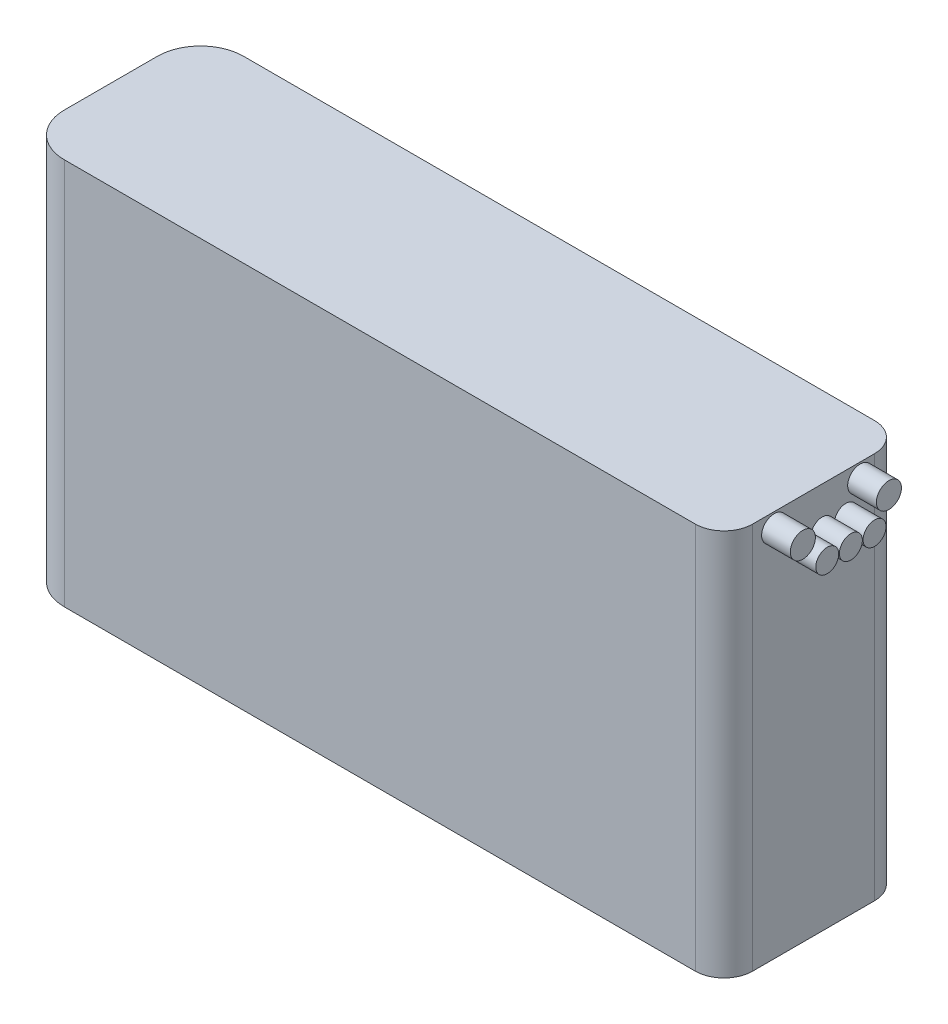
ISO-10303-21;
HEADER;
FILE_DESCRIPTION(('STEP AP214'),'2;1');
FILE_NAME('part.step','',(''),(''),'','','');
FILE_SCHEMA(('AUTOMOTIVE_DESIGN { 1 0 10303 214 1 1 1 1 }'));
ENDSEC;
DATA;
#1=APPLICATION_CONTEXT('core data for automotive mechanical design processes');
#2=APPLICATION_PROTOCOL_DEFINITION('international standard','automotive_design',2000,#1);
#3=PRODUCT_CONTEXT('',#1,'mechanical');
#4=PRODUCT('Part','Part','',(#3));
#5=PRODUCT_RELATED_PRODUCT_CATEGORY('part','',(#4));
#6=PRODUCT_DEFINITION_FORMATION('','',#4);
#7=PRODUCT_DEFINITION_CONTEXT('part definition',#1,'design');
#8=PRODUCT_DEFINITION('design','',#6,#7);
#9=PRODUCT_DEFINITION_SHAPE('','',#8);
#10=(LENGTH_UNIT() NAMED_UNIT(*) SI_UNIT(.MILLI.,.METRE.));
#11=(NAMED_UNIT(*) PLANE_ANGLE_UNIT() SI_UNIT($,.RADIAN.));
#12=(NAMED_UNIT(*) SI_UNIT($,.STERADIAN.) SOLID_ANGLE_UNIT());
#13=UNCERTAINTY_MEASURE_WITH_UNIT(LENGTH_MEASURE(1.E-05),#10,'distance_accuracy_value','');
#14=(GEOMETRIC_REPRESENTATION_CONTEXT(3) GLOBAL_UNCERTAINTY_ASSIGNED_CONTEXT((#13)) GLOBAL_UNIT_ASSIGNED_CONTEXT((#10,
#11,#12)) REPRESENTATION_CONTEXT('',''));
#15=CARTESIAN_POINT('',(0.,0.,0.));
#16=DIRECTION('',(0.,0.,1.));
#17=DIRECTION('',(1.,0.,0.));
#18=AXIS2_PLACEMENT_3D('',#15,#16,#17);
#19=CARTESIAN_POINT('',(0.,0.,12.5));
#20=DIRECTION('',(1.,0.,0.));
#21=DIRECTION('',(0.,0.,-1.));
#22=AXIS2_PLACEMENT_3D('',#19,#20,#21);
#23=PLANE('',#22);
#24=DIRECTION('',(0.,0.,-1.));
#25=VECTOR('',#24,1.);
#26=CARTESIAN_POINT('',(0.,0.,12.5));
#27=LINE('',#26,#25);
#28=CARTESIAN_POINT('',(0.,0.,9.5));
#29=VERTEX_POINT('',#28);
#30=CARTESIAN_POINT('',(0.,0.,3.));
#31=VERTEX_POINT('',#30);
#32=EDGE_CURVE('E136',#29,#31,#27,.T.);
#33=ORIENTED_EDGE('',*,*,#32,.F.);
#34=DIRECTION('',(0.,-1.,0.));
#35=VECTOR('',#34,1.);
#36=CARTESIAN_POINT('',(0.,0.,9.5));
#37=LINE('',#36,#35);
#38=CARTESIAN_POINT('',(0.,27.,9.5));
#39=VERTEX_POINT('',#38);
#40=EDGE_CURVE('E167',#29,#39,#37,.F.);
#41=ORIENTED_EDGE('',*,*,#40,.T.);
#42=DIRECTION('',(0.,0.,-1.));
#43=VECTOR('',#42,1.);
#44=CARTESIAN_POINT('',(0.,27.,12.5));
#45=LINE('',#44,#43);
#46=CARTESIAN_POINT('',(0.,27.,3.));
#47=VERTEX_POINT('',#46);
#48=EDGE_CURVE('E130',#39,#47,#45,.T.);
#49=ORIENTED_EDGE('',*,*,#48,.T.);
#50=DIRECTION('',(0.,-1.,0.));
#51=VECTOR('',#50,1.);
#52=CARTESIAN_POINT('',(0.,0.,3.));
#53=LINE('',#52,#51);
#54=EDGE_CURVE('E163',#47,#31,#53,.T.);
#55=ORIENTED_EDGE('',*,*,#54,.T.);
#56=EDGE_LOOP('',(#33,#41,#49,#55));
#57=FACE_BOUND('',#56,.T.);
#58=ADVANCED_FACE('F39',(#57),#23,.F.);
#59=CARTESIAN_POINT('',(0.,0.,12.5));
#60=DIRECTION('',(0.,1.,0.));
#61=DIRECTION('',(0.,0.,1.));
#62=AXIS2_PLACEMENT_3D('',#59,#60,#61);
#63=PLANE('',#62);
#64=DIRECTION('',(1.,0.,0.));
#65=VECTOR('',#64,1.);
#66=CARTESIAN_POINT('',(0.,0.,12.5));
#67=LINE('',#66,#65);
#68=CARTESIAN_POINT('',(3.,0.,12.5));
#69=VERTEX_POINT('',#68);
#70=CARTESIAN_POINT('',(47.,0.,12.5));
#71=VERTEX_POINT('',#70);
#72=EDGE_CURVE('E240',#69,#71,#67,.T.);
#73=ORIENTED_EDGE('',*,*,#72,.F.);
#74=CARTESIAN_POINT('',(3.,0.,9.5));
#75=DIRECTION('',(0.,1.,0.));
#76=DIRECTION('',(0.,0.,1.));
#77=AXIS2_PLACEMENT_3D('',#74,#75,#76);
#78=CIRCLE('',#77,3.);
#79=EDGE_CURVE('E161',#69,#29,#78,.F.);
#80=ORIENTED_EDGE('',*,*,#79,.T.);
#81=ORIENTED_EDGE('',*,*,#32,.T.);
#82=CARTESIAN_POINT('',(3.,0.,3.));
#83=DIRECTION('',(0.,1.,0.));
#84=DIRECTION('',(0.,0.,1.));
#85=AXIS2_PLACEMENT_3D('',#82,#83,#84);
#86=CIRCLE('',#85,3.);
#87=CARTESIAN_POINT('',(3.,0.,0.));
#88=VERTEX_POINT('',#87);
#89=EDGE_CURVE('E158',#31,#88,#86,.F.);
#90=ORIENTED_EDGE('',*,*,#89,.T.);
#91=DIRECTION('',(1.,0.,0.));
#92=VECTOR('',#91,1.);
#93=CARTESIAN_POINT('',(0.,0.,0.));
#94=LINE('',#93,#92);
#95=CARTESIAN_POINT('',(47.,0.,0.));
#96=VERTEX_POINT('',#95);
#97=EDGE_CURVE('E247',#88,#96,#94,.T.);
#98=ORIENTED_EDGE('',*,*,#97,.T.);
#99=CARTESIAN_POINT('',(47.,0.,2.));
#100=DIRECTION('',(0.,1.,0.));
#101=DIRECTION('',(0.,0.,1.));
#102=AXIS2_PLACEMENT_3D('',#99,#100,#101);
#103=CIRCLE('',#102,2.);
#104=CARTESIAN_POINT('',(49.,0.,2.));
#105=VERTEX_POINT('',#104);
#106=EDGE_CURVE('E151',#96,#105,#103,.F.);
#107=ORIENTED_EDGE('',*,*,#106,.T.);
#108=DIRECTION('',(0.,0.,-1.));
#109=VECTOR('',#108,1.);
#110=CARTESIAN_POINT('',(49.,0.,12.5));
#111=LINE('',#110,#109);
#112=CARTESIAN_POINT('',(49.,0.,10.5));
#113=VERTEX_POINT('',#112);
#114=EDGE_CURVE('E129',#113,#105,#111,.T.);
#115=ORIENTED_EDGE('',*,*,#114,.F.);
#116=CARTESIAN_POINT('',(47.,0.,10.5));
#117=DIRECTION('',(0.,1.,0.));
#118=DIRECTION('',(0.,0.,1.));
#119=AXIS2_PLACEMENT_3D('',#116,#117,#118);
#120=CIRCLE('',#119,2.);
#121=EDGE_CURVE('E135',#113,#71,#120,.F.);
#122=ORIENTED_EDGE('',*,*,#121,.T.);
#123=EDGE_LOOP('',(#73,#80,#81,#90,#98,#107,#115,#122));
#124=FACE_BOUND('',#123,.T.);
#125=ADVANCED_FACE('F189',(#124),#63,.F.);
#126=CARTESIAN_POINT('',(49.,0.,12.5));
#127=DIRECTION('',(-1.,0.,0.));
#128=DIRECTION('',(0.,0.,1.));
#129=AXIS2_PLACEMENT_3D('',#126,#127,#128);
#130=PLANE('',#129);
#131=CARTESIAN_POINT('',(49.,24.2,7.3));
#132=DIRECTION('',(-1.,0.,0.));
#133=DIRECTION('',(0.,0.,1.));
#134=AXIS2_PLACEMENT_3D('',#131,#132,#133);
#135=CIRCLE('',#134,0.799999999999999);
#136=CARTESIAN_POINT('',(49.,24.2,8.1));
#137=VERTEX_POINT('',#136);
#138=EDGE_CURVE('E11',#137,#137,#135,.F.);
#139=ORIENTED_EDGE('',*,*,#138,.F.);
#140=EDGE_LOOP('',(#139));
#141=FACE_BOUND('',#140,.T.);
#142=CARTESIAN_POINT('',(49.,24.2,4.));
#143=DIRECTION('',(-1.,0.,0.));
#144=DIRECTION('',(0.,0.,1.));
#145=AXIS2_PLACEMENT_3D('',#142,#143,#144);
#146=CIRCLE('',#145,0.799999999999997);
#147=CARTESIAN_POINT('',(49.,24.2,4.8));
#148=VERTEX_POINT('',#147);
#149=EDGE_CURVE('E47',#148,#148,#146,.F.);
#150=ORIENTED_EDGE('',*,*,#149,.F.);
#151=EDGE_LOOP('',(#150));
#152=FACE_BOUND('',#151,.T.);
#153=CARTESIAN_POINT('',(49.,24.2,5.65));
#154=DIRECTION('',(-1.,0.,0.));
#155=DIRECTION('',(0.,0.,1.));
#156=AXIS2_PLACEMENT_3D('',#153,#154,#155);
#157=CIRCLE('',#156,0.799999999999998);
#158=CARTESIAN_POINT('',(49.,24.2,6.45));
#159=VERTEX_POINT('',#158);
#160=EDGE_CURVE('E180',#159,#159,#157,.F.);
#161=ORIENTED_EDGE('',*,*,#160,.F.);
#162=EDGE_LOOP('',(#161));
#163=FACE_BOUND('',#162,.T.);
#164=CARTESIAN_POINT('',(49.,26.,3.));
#165=DIRECTION('',(-1.,0.,0.));
#166=DIRECTION('',(0.,0.,1.));
#167=AXIS2_PLACEMENT_3D('',#164,#165,#166);
#168=CIRCLE('',#167,0.875000000000002);
#169=CARTESIAN_POINT('',(49.,26.,3.875));
#170=VERTEX_POINT('',#169);
#171=EDGE_CURVE('E176',#170,#170,#168,.F.);
#172=ORIENTED_EDGE('',*,*,#171,.F.);
#173=EDGE_LOOP('',(#172));
#174=FACE_BOUND('',#173,.T.);
#175=CARTESIAN_POINT('',(49.,26.,9.));
#176=DIRECTION('',(-1.,0.,0.));
#177=DIRECTION('',(0.,0.,1.));
#178=AXIS2_PLACEMENT_3D('',#175,#176,#177);
#179=CIRCLE('',#178,0.875);
#180=CARTESIAN_POINT('',(49.,26.,9.875));
#181=VERTEX_POINT('',#180);
#182=EDGE_CURVE('E173',#181,#181,#179,.F.);
#183=ORIENTED_EDGE('',*,*,#182,.F.);
#184=EDGE_LOOP('',(#183));
#185=FACE_BOUND('',#184,.T.);
#186=ORIENTED_EDGE('',*,*,#114,.T.);
#187=DIRECTION('',(0.,1.,0.));
#188=VECTOR('',#187,1.);
#189=CARTESIAN_POINT('',(49.,27.,2.));
#190=LINE('',#189,#188);
#191=CARTESIAN_POINT('',(49.,27.,2.));
#192=VERTEX_POINT('',#191);
#193=EDGE_CURVE('E119',#105,#192,#190,.T.);
#194=ORIENTED_EDGE('',*,*,#193,.T.);
#195=DIRECTION('',(0.,0.,-1.));
#196=VECTOR('',#195,1.);
#197=CARTESIAN_POINT('',(49.,27.,12.5));
#198=LINE('',#197,#196);
#199=CARTESIAN_POINT('',(49.,27.,10.5));
#200=VERTEX_POINT('',#199);
#201=EDGE_CURVE('E111',#200,#192,#198,.T.);
#202=ORIENTED_EDGE('',*,*,#201,.F.);
#203=DIRECTION('',(0.,1.,0.));
#204=VECTOR('',#203,1.);
#205=CARTESIAN_POINT('',(49.,0.,10.5));
#206=LINE('',#205,#204);
#207=EDGE_CURVE('E125',#200,#113,#206,.F.);
#208=ORIENTED_EDGE('',*,*,#207,.T.);
#209=EDGE_LOOP('',(#186,#194,#202,#208));
#210=FACE_BOUND('',#209,.T.);
#211=ADVANCED_FACE('F124',(#141,#152,#163,#174,#185,#210),#130,.F.);
#212=CARTESIAN_POINT('',(0.,27.,12.5));
#213=DIRECTION('',(0.,-1.,0.));
#214=DIRECTION('',(0.,0.,-1.));
#215=AXIS2_PLACEMENT_3D('',#212,#213,#214);
#216=PLANE('',#215);
#217=ORIENTED_EDGE('',*,*,#48,.F.);
#218=CARTESIAN_POINT('',(3.,27.,9.5));
#219=DIRECTION('',(0.,-1.,0.));
#220=DIRECTION('',(0.,0.,-1.));
#221=AXIS2_PLACEMENT_3D('',#218,#219,#220);
#222=CIRCLE('',#221,3.);
#223=CARTESIAN_POINT('',(3.,27.,12.5));
#224=VERTEX_POINT('',#223);
#225=EDGE_CURVE('E170',#39,#224,#222,.F.);
#226=ORIENTED_EDGE('',*,*,#225,.T.);
#227=DIRECTION('',(-1.,0.,0.));
#228=VECTOR('',#227,1.);
#229=CARTESIAN_POINT('',(0.,27.,12.5));
#230=LINE('',#229,#228);
#231=CARTESIAN_POINT('',(47.,27.,12.5));
#232=VERTEX_POINT('',#231);
#233=EDGE_CURVE('E113',#232,#224,#230,.T.);
#234=ORIENTED_EDGE('',*,*,#233,.F.);
#235=CARTESIAN_POINT('',(47.,27.,10.5));
#236=DIRECTION('',(0.,-1.,0.));
#237=DIRECTION('',(0.,0.,-1.));
#238=AXIS2_PLACEMENT_3D('',#235,#236,#237);
#239=CIRCLE('',#238,2.);
#240=EDGE_CURVE('E108',#232,#200,#239,.F.);
#241=ORIENTED_EDGE('',*,*,#240,.T.);
#242=ORIENTED_EDGE('',*,*,#201,.T.);
#243=CARTESIAN_POINT('',(47.,27.,2.));
#244=DIRECTION('',(0.,-1.,0.));
#245=DIRECTION('',(0.,0.,-1.));
#246=AXIS2_PLACEMENT_3D('',#243,#244,#245);
#247=CIRCLE('',#246,2.);
#248=CARTESIAN_POINT('',(47.,27.,0.));
#249=VERTEX_POINT('',#248);
#250=EDGE_CURVE('E118',#192,#249,#247,.F.);
#251=ORIENTED_EDGE('',*,*,#250,.T.);
#252=DIRECTION('',(-1.,0.,0.));
#253=VECTOR('',#252,1.);
#254=CARTESIAN_POINT('',(0.,27.,0.));
#255=LINE('',#254,#253);
#256=CARTESIAN_POINT('',(3.,27.,0.));
#257=VERTEX_POINT('',#256);
#258=EDGE_CURVE('E243',#249,#257,#255,.T.);
#259=ORIENTED_EDGE('',*,*,#258,.T.);
#260=CARTESIAN_POINT('',(3.,27.,3.));
#261=DIRECTION('',(0.,-1.,0.));
#262=DIRECTION('',(0.,0.,-1.));
#263=AXIS2_PLACEMENT_3D('',#260,#261,#262);
#264=CIRCLE('',#263,3.);
#265=EDGE_CURVE('E61',#257,#47,#264,.F.);
#266=ORIENTED_EDGE('',*,*,#265,.T.);
#267=EDGE_LOOP('',(#217,#226,#234,#241,#242,#251,#259,#266));
#268=FACE_BOUND('',#267,.T.);
#269=ADVANCED_FACE('F110',(#268),#216,.F.);
#270=CARTESIAN_POINT('',(0.,0.,12.5));
#271=DIRECTION('',(0.,0.,-1.));
#272=DIRECTION('',(-1.,0.,0.));
#273=AXIS2_PLACEMENT_3D('',#270,#271,#272);
#274=PLANE('',#273);
#275=ORIENTED_EDGE('',*,*,#233,.T.);
#276=DIRECTION('',(0.,-1.,0.));
#277=VECTOR('',#276,1.);
#278=CARTESIAN_POINT('',(3.,0.,12.5));
#279=LINE('',#278,#277);
#280=EDGE_CURVE('E155',#224,#69,#279,.T.);
#281=ORIENTED_EDGE('',*,*,#280,.T.);
#282=ORIENTED_EDGE('',*,*,#72,.T.);
#283=DIRECTION('',(0.,1.,0.));
#284=VECTOR('',#283,1.);
#285=CARTESIAN_POINT('',(47.,0.,12.5));
#286=LINE('',#285,#284);
#287=EDGE_CURVE('E153',#71,#232,#286,.T.);
#288=ORIENTED_EDGE('',*,*,#287,.T.);
#289=EDGE_LOOP('',(#275,#281,#282,#288));
#290=FACE_BOUND('',#289,.T.);
#291=ADVANCED_FACE('F238',(#290),#274,.F.);
#292=CARTESIAN_POINT('',(0.,0.,0.));
#293=DIRECTION('',(0.,0.,-1.));
#294=DIRECTION('',(-1.,0.,0.));
#295=AXIS2_PLACEMENT_3D('',#292,#293,#294);
#296=PLANE('',#295);
#297=ORIENTED_EDGE('',*,*,#97,.F.);
#298=DIRECTION('',(0.,-1.,0.));
#299=VECTOR('',#298,1.);
#300=CARTESIAN_POINT('',(3.,27.,0.));
#301=LINE('',#300,#299);
#302=EDGE_CURVE('E54',#88,#257,#301,.F.);
#303=ORIENTED_EDGE('',*,*,#302,.T.);
#304=ORIENTED_EDGE('',*,*,#258,.F.);
#305=DIRECTION('',(0.,1.,0.));
#306=VECTOR('',#305,1.);
#307=CARTESIAN_POINT('',(47.,0.,0.));
#308=LINE('',#307,#306);
#309=EDGE_CURVE('E147',#249,#96,#308,.F.);
#310=ORIENTED_EDGE('',*,*,#309,.T.);
#311=EDGE_LOOP('',(#297,#303,#304,#310));
#312=FACE_BOUND('',#311,.T.);
#313=ADVANCED_FACE('F227',(#312),#296,.T.);
#314=CARTESIAN_POINT('',(47.,0.,2.));
#315=DIRECTION('',(0.,-1.,0.));
#316=DIRECTION('',(0.,0.,-1.));
#317=AXIS2_PLACEMENT_3D('',#314,#315,#316);
#318=CYLINDRICAL_SURFACE('',#317,2.);
#319=ORIENTED_EDGE('',*,*,#106,.F.);
#320=ORIENTED_EDGE('',*,*,#309,.F.);
#321=ORIENTED_EDGE('',*,*,#250,.F.);
#322=ORIENTED_EDGE('',*,*,#193,.F.);
#323=EDGE_LOOP('',(#319,#320,#321,#322));
#324=FACE_BOUND('',#323,.T.);
#325=ADVANCED_FACE('F224',(#324),#318,.T.);
#326=CARTESIAN_POINT('',(47.,0.,10.5));
#327=DIRECTION('',(0.,1.,0.));
#328=DIRECTION('',(0.,0.,1.));
#329=AXIS2_PLACEMENT_3D('',#326,#327,#328);
#330=CYLINDRICAL_SURFACE('',#329,2.);
#331=ORIENTED_EDGE('',*,*,#121,.F.);
#332=ORIENTED_EDGE('',*,*,#207,.F.);
#333=ORIENTED_EDGE('',*,*,#240,.F.);
#334=ORIENTED_EDGE('',*,*,#287,.F.);
#335=EDGE_LOOP('',(#331,#332,#333,#334));
#336=FACE_BOUND('',#335,.T.);
#337=ADVANCED_FACE('F133',(#336),#330,.T.);
#338=CARTESIAN_POINT('',(3.,0.,9.5));
#339=DIRECTION('',(0.,-1.,0.));
#340=DIRECTION('',(0.,0.,-1.));
#341=AXIS2_PLACEMENT_3D('',#338,#339,#340);
#342=CYLINDRICAL_SURFACE('',#341,3.);
#343=ORIENTED_EDGE('',*,*,#225,.F.);
#344=ORIENTED_EDGE('',*,*,#40,.F.);
#345=ORIENTED_EDGE('',*,*,#79,.F.);
#346=ORIENTED_EDGE('',*,*,#280,.F.);
#347=EDGE_LOOP('',(#343,#344,#345,#346));
#348=FACE_BOUND('',#347,.T.);
#349=ADVANCED_FACE('F210',(#348),#342,.T.);
#350=CARTESIAN_POINT('',(3.,0.,3.));
#351=DIRECTION('',(0.,1.,0.));
#352=DIRECTION('',(0.,0.,1.));
#353=AXIS2_PLACEMENT_3D('',#350,#351,#352);
#354=CYLINDRICAL_SURFACE('',#353,3.);
#355=ORIENTED_EDGE('',*,*,#265,.F.);
#356=ORIENTED_EDGE('',*,*,#302,.F.);
#357=ORIENTED_EDGE('',*,*,#89,.F.);
#358=ORIENTED_EDGE('',*,*,#54,.F.);
#359=EDGE_LOOP('',(#355,#356,#357,#358));
#360=FACE_BOUND('',#359,.T.);
#361=ADVANCED_FACE('F41',(#360),#354,.T.);
#362=CARTESIAN_POINT('',(51.,26.,9.));
#363=DIRECTION('',(-1.,0.,0.));
#364=DIRECTION('',(0.,0.,1.));
#365=AXIS2_PLACEMENT_3D('',#362,#363,#364);
#366=CYLINDRICAL_SURFACE('',#365,0.875);
#367=CARTESIAN_POINT('',(51.,26.,9.));
#368=DIRECTION('',(1.,0.,0.));
#369=DIRECTION('',(0.,0.,-1.));
#370=AXIS2_PLACEMENT_3D('',#367,#368,#369);
#371=CIRCLE('',#370,0.875);
#372=CARTESIAN_POINT('',(51.,26.,8.125));
#373=VERTEX_POINT('',#372);
#374=EDGE_CURVE('E249',#373,#373,#371,.T.);
#375=ORIENTED_EDGE('',*,*,#374,.F.);
#376=EDGE_LOOP('',(#375));
#377=FACE_BOUND('',#376,.T.);
#378=ORIENTED_EDGE('',*,*,#182,.T.);
#379=EDGE_LOOP('',(#378));
#380=FACE_BOUND('',#379,.T.);
#381=ADVANCED_FACE('F198',(#377,#380),#366,.T.);
#382=CARTESIAN_POINT('',(51.,26.,9.));
#383=DIRECTION('',(1.,0.,0.));
#384=DIRECTION('',(0.,0.,-1.));
#385=AXIS2_PLACEMENT_3D('',#382,#383,#384);
#386=PLANE('',#385);
#387=ORIENTED_EDGE('',*,*,#374,.T.);
#388=EDGE_LOOP('',(#387));
#389=FACE_BOUND('',#388,.T.);
#390=ADVANCED_FACE('F200',(#389),#386,.T.);
#391=CARTESIAN_POINT('',(51.,26.,3.));
#392=DIRECTION('',(-1.,0.,0.));
#393=DIRECTION('',(0.,0.,1.));
#394=AXIS2_PLACEMENT_3D('',#391,#392,#393);
#395=CYLINDRICAL_SURFACE('',#394,0.875000000000002);
#396=CARTESIAN_POINT('',(51.,26.,3.));
#397=DIRECTION('',(1.,0.,0.));
#398=DIRECTION('',(0.,0.,-1.));
#399=AXIS2_PLACEMENT_3D('',#396,#397,#398);
#400=CIRCLE('',#399,0.875000000000002);
#401=CARTESIAN_POINT('',(51.,26.,2.125));
#402=VERTEX_POINT('',#401);
#403=EDGE_CURVE('E395',#402,#402,#400,.T.);
#404=ORIENTED_EDGE('',*,*,#403,.F.);
#405=EDGE_LOOP('',(#404));
#406=FACE_BOUND('',#405,.T.);
#407=ORIENTED_EDGE('',*,*,#171,.T.);
#408=EDGE_LOOP('',(#407));
#409=FACE_BOUND('',#408,.T.);
#410=ADVANCED_FACE('F207',(#406,#409),#395,.T.);
#411=CARTESIAN_POINT('',(51.,26.,3.));
#412=DIRECTION('',(1.,0.,0.));
#413=DIRECTION('',(0.,0.,-1.));
#414=AXIS2_PLACEMENT_3D('',#411,#412,#413);
#415=PLANE('',#414);
#416=ORIENTED_EDGE('',*,*,#403,.T.);
#417=EDGE_LOOP('',(#416));
#418=FACE_BOUND('',#417,.T.);
#419=ADVANCED_FACE('F311',(#418),#415,.T.);
#420=CARTESIAN_POINT('',(51.,24.2,5.65));
#421=DIRECTION('',(-1.,0.,0.));
#422=DIRECTION('',(0.,0.,1.));
#423=AXIS2_PLACEMENT_3D('',#420,#421,#422);
#424=CYLINDRICAL_SURFACE('',#423,0.799999999999998);
#425=CARTESIAN_POINT('',(51.,24.2,5.65));
#426=DIRECTION('',(1.,0.,0.));
#427=DIRECTION('',(0.,0.,-1.));
#428=AXIS2_PLACEMENT_3D('',#425,#426,#427);
#429=CIRCLE('',#428,0.799999999999998);
#430=CARTESIAN_POINT('',(51.,24.2,4.85));
#431=VERTEX_POINT('',#430);
#432=EDGE_CURVE('E390',#431,#431,#429,.T.);
#433=ORIENTED_EDGE('',*,*,#432,.F.);
#434=EDGE_LOOP('',(#433));
#435=FACE_BOUND('',#434,.T.);
#436=ORIENTED_EDGE('',*,*,#160,.T.);
#437=EDGE_LOOP('',(#436));
#438=FACE_BOUND('',#437,.T.);
#439=ADVANCED_FACE('F321',(#435,#438),#424,.T.);
#440=CARTESIAN_POINT('',(51.,24.2,5.65));
#441=DIRECTION('',(1.,0.,0.));
#442=DIRECTION('',(0.,0.,-1.));
#443=AXIS2_PLACEMENT_3D('',#440,#441,#442);
#444=PLANE('',#443);
#445=ORIENTED_EDGE('',*,*,#432,.T.);
#446=EDGE_LOOP('',(#445));
#447=FACE_BOUND('',#446,.T.);
#448=ADVANCED_FACE('F331',(#447),#444,.T.);
#449=CARTESIAN_POINT('',(51.,24.2,4.));
#450=DIRECTION('',(-1.,0.,0.));
#451=DIRECTION('',(0.,0.,1.));
#452=AXIS2_PLACEMENT_3D('',#449,#450,#451);
#453=CYLINDRICAL_SURFACE('',#452,0.799999999999997);
#454=CARTESIAN_POINT('',(51.,24.2,4.));
#455=DIRECTION('',(1.,0.,0.));
#456=DIRECTION('',(0.,0.,-1.));
#457=AXIS2_PLACEMENT_3D('',#454,#455,#456);
#458=CIRCLE('',#457,0.799999999999997);
#459=CARTESIAN_POINT('',(51.,24.2,3.2));
#460=VERTEX_POINT('',#459);
#461=EDGE_CURVE('E387',#460,#460,#458,.T.);
#462=ORIENTED_EDGE('',*,*,#461,.F.);
#463=EDGE_LOOP('',(#462));
#464=FACE_BOUND('',#463,.T.);
#465=ORIENTED_EDGE('',*,*,#149,.T.);
#466=EDGE_LOOP('',(#465));
#467=FACE_BOUND('',#466,.T.);
#468=ADVANCED_FACE('F185',(#464,#467),#453,.T.);
#469=CARTESIAN_POINT('',(51.,24.2,4.));
#470=DIRECTION('',(1.,0.,0.));
#471=DIRECTION('',(0.,0.,-1.));
#472=AXIS2_PLACEMENT_3D('',#469,#470,#471);
#473=PLANE('',#472);
#474=ORIENTED_EDGE('',*,*,#461,.T.);
#475=EDGE_LOOP('',(#474));
#476=FACE_BOUND('',#475,.T.);
#477=ADVANCED_FACE('F350',(#476),#473,.T.);
#478=CARTESIAN_POINT('',(51.,24.2,7.3));
#479=DIRECTION('',(-1.,0.,0.));
#480=DIRECTION('',(0.,0.,1.));
#481=AXIS2_PLACEMENT_3D('',#478,#479,#480);
#482=CYLINDRICAL_SURFACE('',#481,0.799999999999999);
#483=CARTESIAN_POINT('',(51.,24.2,7.3));
#484=DIRECTION('',(1.,0.,0.));
#485=DIRECTION('',(0.,0.,-1.));
#486=AXIS2_PLACEMENT_3D('',#483,#484,#485);
#487=CIRCLE('',#486,0.799999999999999);
#488=CARTESIAN_POINT('',(51.,24.2,6.5));
#489=VERTEX_POINT('',#488);
#490=EDGE_CURVE('E386',#489,#489,#487,.T.);
#491=ORIENTED_EDGE('',*,*,#490,.F.);
#492=EDGE_LOOP('',(#491));
#493=FACE_BOUND('',#492,.T.);
#494=ORIENTED_EDGE('',*,*,#138,.T.);
#495=EDGE_LOOP('',(#494));
#496=FACE_BOUND('',#495,.T.);
#497=ADVANCED_FACE('F360',(#493,#496),#482,.T.);
#498=CARTESIAN_POINT('',(51.,24.2,7.3));
#499=DIRECTION('',(1.,0.,0.));
#500=DIRECTION('',(0.,0.,-1.));
#501=AXIS2_PLACEMENT_3D('',#498,#499,#500);
#502=PLANE('',#501);
#503=ORIENTED_EDGE('',*,*,#490,.T.);
#504=EDGE_LOOP('',(#503));
#505=FACE_BOUND('',#504,.T.);
#506=ADVANCED_FACE('F370',(#505),#502,.T.);
#507=CLOSED_SHELL('',(#58,#125,#211,#269,#291,#313,#325,#337,#349,#361,#381,#390,#410,#419,#439,
#448,#468,#477,#497,#506));
#508=MANIFOLD_SOLID_BREP('B2',#507);
#509=ADVANCED_BREP_SHAPE_REPRESENTATION('',(#18,#508),#14);
#510=SHAPE_DEFINITION_REPRESENTATION(#9,#509);
ENDSEC;
END-ISO-10303-21;
